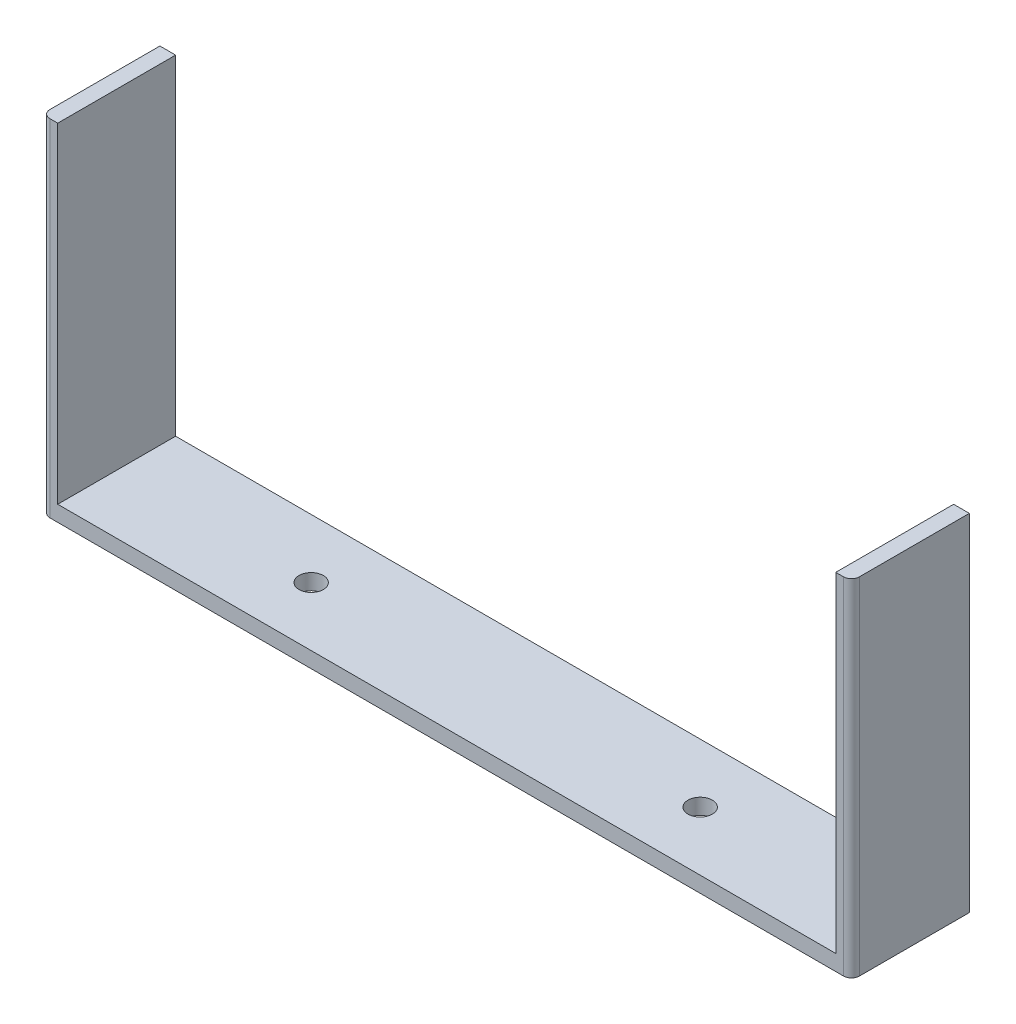
ISO-10303-21;
HEADER;
FILE_DESCRIPTION(('STEP AP214'),'2;1');
FILE_NAME('part.step','',(''),(''),'','','');
FILE_SCHEMA(('AUTOMOTIVE_DESIGN { 1 0 10303 214 1 1 1 1 }'));
ENDSEC;
DATA;
#1=APPLICATION_CONTEXT('core data for automotive mechanical design processes');
#2=APPLICATION_PROTOCOL_DEFINITION('international standard','automotive_design',2000,#1);
#3=PRODUCT_CONTEXT('',#1,'mechanical');
#4=PRODUCT('Part','Part','',(#3));
#5=PRODUCT_RELATED_PRODUCT_CATEGORY('part','',(#4));
#6=PRODUCT_DEFINITION_FORMATION('','',#4);
#7=PRODUCT_DEFINITION_CONTEXT('part definition',#1,'design');
#8=PRODUCT_DEFINITION('design','',#6,#7);
#9=PRODUCT_DEFINITION_SHAPE('','',#8);
#10=(LENGTH_UNIT() NAMED_UNIT(*) SI_UNIT(.MILLI.,.METRE.));
#11=(NAMED_UNIT(*) PLANE_ANGLE_UNIT() SI_UNIT($,.RADIAN.));
#12=(NAMED_UNIT(*) SI_UNIT($,.STERADIAN.) SOLID_ANGLE_UNIT());
#13=UNCERTAINTY_MEASURE_WITH_UNIT(LENGTH_MEASURE(1.E-05),#10,'distance_accuracy_value','');
#14=(GEOMETRIC_REPRESENTATION_CONTEXT(3) GLOBAL_UNCERTAINTY_ASSIGNED_CONTEXT((#13)) GLOBAL_UNIT_ASSIGNED_CONTEXT((#10,
#11,#12)) REPRESENTATION_CONTEXT('',''));
#15=CARTESIAN_POINT('',(0.,0.,0.));
#16=DIRECTION('',(0.,0.,1.));
#17=DIRECTION('',(1.,0.,0.));
#18=AXIS2_PLACEMENT_3D('',#15,#16,#17);
#19=CARTESIAN_POINT('',(-51.5,-2.,7.5));
#20=DIRECTION('',(-1.,0.,0.));
#21=DIRECTION('',(0.,0.,1.));
#22=AXIS2_PLACEMENT_3D('',#19,#20,#21);
#23=PLANE('',#22);
#24=DIRECTION('',(0.,0.,1.));
#25=VECTOR('',#24,1.);
#26=CARTESIAN_POINT('',(-51.5,-2.,7.5));
#27=LINE('',#26,#25);
#28=CARTESIAN_POINT('',(-51.5,-2.,-7.5));
#29=VERTEX_POINT('',#28);
#30=CARTESIAN_POINT('',(-51.5,-2.,6.5));
#31=VERTEX_POINT('',#30);
#32=EDGE_CURVE('E174',#29,#31,#27,.T.);
#33=ORIENTED_EDGE('',*,*,#32,.T.);
#34=DIRECTION('',(0.,1.,0.));
#35=VECTOR('',#34,1.);
#36=CARTESIAN_POINT('',(-51.5,-2.,6.5));
#37=LINE('',#36,#35);
#38=CARTESIAN_POINT('',(-51.5,42.,6.5));
#39=VERTEX_POINT('',#38);
#40=EDGE_CURVE('E126',#31,#39,#37,.T.);
#41=ORIENTED_EDGE('',*,*,#40,.T.);
#42=DIRECTION('',(0.,0.,1.));
#43=VECTOR('',#42,1.);
#44=CARTESIAN_POINT('',(-51.5,42.,-7.5));
#45=LINE('',#44,#43);
#46=CARTESIAN_POINT('',(-51.5,42.,-7.5));
#47=VERTEX_POINT('',#46);
#48=EDGE_CURVE('E131',#47,#39,#45,.T.);
#49=ORIENTED_EDGE('',*,*,#48,.F.);
#50=DIRECTION('',(0.,1.,0.));
#51=VECTOR('',#50,1.);
#52=CARTESIAN_POINT('',(-51.5,-2.,-7.5));
#53=LINE('',#52,#51);
#54=EDGE_CURVE('E113',#29,#47,#53,.T.);
#55=ORIENTED_EDGE('',*,*,#54,.F.);
#56=EDGE_LOOP('',(#33,#41,#49,#55));
#57=FACE_BOUND('',#56,.T.);
#58=ADVANCED_FACE('F39',(#57),#23,.T.);
#59=CARTESIAN_POINT('',(51.5,-2.,-7.50000000000001));
#60=DIRECTION('',(0.,0.,-1.));
#61=DIRECTION('',(-1.,0.,0.));
#62=AXIS2_PLACEMENT_3D('',#59,#60,#61);
#63=PLANE('',#62);
#64=DIRECTION('',(-1.,0.,0.));
#65=VECTOR('',#64,1.);
#66=CARTESIAN_POINT('',(51.5,0.,-7.50000000000001));
#67=LINE('',#66,#65);
#68=CARTESIAN_POINT('',(49.5,0.,-7.50000000000001));
#69=VERTEX_POINT('',#68);
#70=CARTESIAN_POINT('',(-49.5,0.,-7.5));
#71=VERTEX_POINT('',#70);
#72=EDGE_CURVE('E177',#69,#71,#67,.T.);
#73=ORIENTED_EDGE('',*,*,#72,.F.);
#74=DIRECTION('',(0.,-1.,0.));
#75=VECTOR('',#74,1.);
#76=CARTESIAN_POINT('',(49.5,42.,-7.50000000000001));
#77=LINE('',#76,#75);
#78=CARTESIAN_POINT('',(49.5,42.,-7.50000000000001));
#79=VERTEX_POINT('',#78);
#80=EDGE_CURVE('E157',#79,#69,#77,.T.);
#81=ORIENTED_EDGE('',*,*,#80,.F.);
#82=DIRECTION('',(-1.,0.,0.));
#83=VECTOR('',#82,1.);
#84=CARTESIAN_POINT('',(49.5,42.,-7.50000000000001));
#85=LINE('',#84,#83);
#86=CARTESIAN_POINT('',(51.5,42.,-7.50000000000001));
#87=VERTEX_POINT('',#86);
#88=EDGE_CURVE('E171',#87,#79,#85,.T.);
#89=ORIENTED_EDGE('',*,*,#88,.F.);
#90=DIRECTION('',(0.,1.,0.));
#91=VECTOR('',#90,1.);
#92=CARTESIAN_POINT('',(51.5,-2.,-7.50000000000001));
#93=LINE('',#92,#91);
#94=CARTESIAN_POINT('',(51.5,-2.,-7.50000000000001));
#95=VERTEX_POINT('',#94);
#96=EDGE_CURVE('E127',#95,#87,#93,.T.);
#97=ORIENTED_EDGE('',*,*,#96,.F.);
#98=DIRECTION('',(-1.,0.,0.));
#99=VECTOR('',#98,1.);
#100=CARTESIAN_POINT('',(51.5,-2.,-7.50000000000001));
#101=LINE('',#100,#99);
#102=EDGE_CURVE('E122',#95,#29,#101,.T.);
#103=ORIENTED_EDGE('',*,*,#102,.T.);
#104=ORIENTED_EDGE('',*,*,#54,.T.);
#105=DIRECTION('',(-1.,0.,0.));
#106=VECTOR('',#105,1.);
#107=CARTESIAN_POINT('',(-49.5,42.,-7.5));
#108=LINE('',#107,#106);
#109=CARTESIAN_POINT('',(-49.5,42.,-7.5));
#110=VERTEX_POINT('',#109);
#111=EDGE_CURVE('E119',#110,#47,#108,.T.);
#112=ORIENTED_EDGE('',*,*,#111,.F.);
#113=DIRECTION('',(0.,-1.,0.));
#114=VECTOR('',#113,1.);
#115=CARTESIAN_POINT('',(-49.5,42.,-7.5));
#116=LINE('',#115,#114);
#117=EDGE_CURVE('E150',#110,#71,#116,.T.);
#118=ORIENTED_EDGE('',*,*,#117,.T.);
#119=EDGE_LOOP('',(#73,#81,#89,#97,#103,#104,#112,#118));
#120=FACE_BOUND('',#119,.T.);
#121=ADVANCED_FACE('F116',(#120),#63,.T.);
#122=CARTESIAN_POINT('',(51.5,-2.,7.49999999999999));
#123=DIRECTION('',(1.,0.,0.));
#124=DIRECTION('',(0.,0.,-1.));
#125=AXIS2_PLACEMENT_3D('',#122,#123,#124);
#126=PLANE('',#125);
#127=DIRECTION('',(0.,0.,-1.));
#128=VECTOR('',#127,1.);
#129=CARTESIAN_POINT('',(51.5,42.,-7.50000000000001));
#130=LINE('',#129,#128);
#131=CARTESIAN_POINT('',(51.5,42.,6.49999999999999));
#132=VERTEX_POINT('',#131);
#133=EDGE_CURVE('E167',#132,#87,#130,.T.);
#134=ORIENTED_EDGE('',*,*,#133,.F.);
#135=DIRECTION('',(0.,1.,0.));
#136=VECTOR('',#135,1.);
#137=CARTESIAN_POINT('',(51.5,-2.,6.49999999999999));
#138=LINE('',#137,#136);
#139=CARTESIAN_POINT('',(51.5,-2.,6.49999999999999));
#140=VERTEX_POINT('',#139);
#141=EDGE_CURVE('E11',#132,#140,#138,.F.);
#142=ORIENTED_EDGE('',*,*,#141,.T.);
#143=DIRECTION('',(0.,0.,-1.));
#144=VECTOR('',#143,1.);
#145=CARTESIAN_POINT('',(51.5,-2.,7.49999999999999));
#146=LINE('',#145,#144);
#147=EDGE_CURVE('E180',#140,#95,#146,.T.);
#148=ORIENTED_EDGE('',*,*,#147,.T.);
#149=ORIENTED_EDGE('',*,*,#96,.T.);
#150=EDGE_LOOP('',(#134,#142,#148,#149));
#151=FACE_BOUND('',#150,.T.);
#152=ADVANCED_FACE('F236',(#151),#126,.T.);
#153=CARTESIAN_POINT('',(51.5,-2.,7.49999999999999));
#154=DIRECTION('',(0.,0.,1.));
#155=DIRECTION('',(1.,0.,0.));
#156=AXIS2_PLACEMENT_3D('',#153,#154,#155);
#157=PLANE('',#156);
#158=DIRECTION('',(1.,0.,0.));
#159=VECTOR('',#158,1.);
#160=CARTESIAN_POINT('',(-49.5,42.,7.5));
#161=LINE('',#160,#159);
#162=CARTESIAN_POINT('',(-50.5,42.,7.5));
#163=VERTEX_POINT('',#162);
#164=CARTESIAN_POINT('',(-49.5,42.,7.5));
#165=VERTEX_POINT('',#164);
#166=EDGE_CURVE('E134',#163,#165,#161,.T.);
#167=ORIENTED_EDGE('',*,*,#166,.F.);
#168=DIRECTION('',(0.,1.,0.));
#169=VECTOR('',#168,1.);
#170=CARTESIAN_POINT('',(-50.5,-2.,7.5));
#171=LINE('',#170,#169);
#172=CARTESIAN_POINT('',(-50.5,-2.,7.5));
#173=VERTEX_POINT('',#172);
#174=EDGE_CURVE('E193',#163,#173,#171,.F.);
#175=ORIENTED_EDGE('',*,*,#174,.T.);
#176=DIRECTION('',(1.,0.,0.));
#177=VECTOR('',#176,1.);
#178=CARTESIAN_POINT('',(51.5,-2.,7.49999999999999));
#179=LINE('',#178,#177);
#180=CARTESIAN_POINT('',(50.5,-2.,7.49999999999999));
#181=VERTEX_POINT('',#180);
#182=EDGE_CURVE('E176',#173,#181,#179,.T.);
#183=ORIENTED_EDGE('',*,*,#182,.T.);
#184=DIRECTION('',(0.,1.,0.));
#185=VECTOR('',#184,1.);
#186=CARTESIAN_POINT('',(50.5,-2.,7.49999999999999));
#187=LINE('',#186,#185);
#188=CARTESIAN_POINT('',(50.5,42.,7.49999999999999));
#189=VERTEX_POINT('',#188);
#190=EDGE_CURVE('E190',#181,#189,#187,.T.);
#191=ORIENTED_EDGE('',*,*,#190,.T.);
#192=DIRECTION('',(1.,0.,0.));
#193=VECTOR('',#192,1.);
#194=CARTESIAN_POINT('',(49.5,42.,7.49999999999999));
#195=LINE('',#194,#193);
#196=CARTESIAN_POINT('',(49.5,42.,7.49999999999999));
#197=VERTEX_POINT('',#196);
#198=EDGE_CURVE('E164',#197,#189,#195,.T.);
#199=ORIENTED_EDGE('',*,*,#198,.F.);
#200=DIRECTION('',(0.,-1.,0.));
#201=VECTOR('',#200,1.);
#202=CARTESIAN_POINT('',(49.5,42.,7.49999999999999));
#203=LINE('',#202,#201);
#204=CARTESIAN_POINT('',(49.5,0.,7.49999999999999));
#205=VERTEX_POINT('',#204);
#206=EDGE_CURVE('E160',#197,#205,#203,.T.);
#207=ORIENTED_EDGE('',*,*,#206,.T.);
#208=DIRECTION('',(1.,0.,0.));
#209=VECTOR('',#208,1.);
#210=CARTESIAN_POINT('',(51.5,0.,7.49999999999999));
#211=LINE('',#210,#209);
#212=CARTESIAN_POINT('',(-49.5,0.,7.5));
#213=VERTEX_POINT('',#212);
#214=EDGE_CURVE('E156',#213,#205,#211,.T.);
#215=ORIENTED_EDGE('',*,*,#214,.F.);
#216=DIRECTION('',(0.,-1.,0.));
#217=VECTOR('',#216,1.);
#218=CARTESIAN_POINT('',(-49.5,42.,7.5));
#219=LINE('',#218,#217);
#220=EDGE_CURVE('E153',#165,#213,#219,.T.);
#221=ORIENTED_EDGE('',*,*,#220,.F.);
#222=EDGE_LOOP('',(#167,#175,#183,#191,#199,#207,#215,#221));
#223=FACE_BOUND('',#222,.T.);
#224=ADVANCED_FACE('F208',(#223),#157,.T.);
#225=CARTESIAN_POINT('',(0.,-2.,0.));
#226=DIRECTION('',(0.,1.,0.));
#227=DIRECTION('',(0.,0.,1.));
#228=AXIS2_PLACEMENT_3D('',#225,#226,#227);
#229=PLANE('',#228);
#230=CARTESIAN_POINT('',(24.75,-2.,0.));
#231=DIRECTION('',(0.,1.,0.));
#232=DIRECTION('',(0.,0.,1.));
#233=AXIS2_PLACEMENT_3D('',#230,#231,#232);
#234=CIRCLE('',#233,1.54999999999999);
#235=CARTESIAN_POINT('',(24.75,-2.,1.54999999999999));
#236=VERTEX_POINT('',#235);
#237=EDGE_CURVE('E161',#236,#236,#234,.T.);
#238=ORIENTED_EDGE('',*,*,#237,.T.);
#239=EDGE_LOOP('',(#238));
#240=FACE_BOUND('',#239,.T.);
#241=CARTESIAN_POINT('',(-24.75,-2.,0.));
#242=DIRECTION('',(0.,1.,0.));
#243=DIRECTION('',(0.,0.,-1.));
#244=AXIS2_PLACEMENT_3D('',#241,#242,#243);
#245=CIRCLE('',#244,1.55);
#246=CARTESIAN_POINT('',(-24.75,-2.,-1.55000000000008));
#247=VERTEX_POINT('',#246);
#248=EDGE_CURVE('E146',#247,#247,#245,.T.);
#249=ORIENTED_EDGE('',*,*,#248,.T.);
#250=EDGE_LOOP('',(#249));
#251=FACE_BOUND('',#250,.T.);
#252=ORIENTED_EDGE('',*,*,#182,.F.);
#253=CARTESIAN_POINT('',(-50.5,-2.,6.5));
#254=DIRECTION('',(0.,1.,0.));
#255=DIRECTION('',(0.,0.,1.));
#256=AXIS2_PLACEMENT_3D('',#253,#254,#255);
#257=CIRCLE('',#256,1.);
#258=EDGE_CURVE('E197',#173,#31,#257,.F.);
#259=ORIENTED_EDGE('',*,*,#258,.T.);
#260=ORIENTED_EDGE('',*,*,#32,.F.);
#261=ORIENTED_EDGE('',*,*,#102,.F.);
#262=ORIENTED_EDGE('',*,*,#147,.F.);
#263=CARTESIAN_POINT('',(50.5,-2.,6.49999999999999));
#264=DIRECTION('',(0.,1.,0.));
#265=DIRECTION('',(0.,0.,1.));
#266=AXIS2_PLACEMENT_3D('',#263,#264,#265);
#267=CIRCLE('',#266,1.);
#268=EDGE_CURVE('E195',#140,#181,#267,.F.);
#269=ORIENTED_EDGE('',*,*,#268,.T.);
#270=EDGE_LOOP('',(#252,#259,#260,#261,#262,#269));
#271=FACE_BOUND('',#270,.T.);
#272=ADVANCED_FACE('F201',(#240,#251,#271),#229,.F.);
#273=CARTESIAN_POINT('',(0.,0.,0.));
#274=DIRECTION('',(0.,1.,0.));
#275=DIRECTION('',(0.,0.,1.));
#276=AXIS2_PLACEMENT_3D('',#273,#274,#275);
#277=PLANE('',#276);
#278=CARTESIAN_POINT('',(24.75,0.,0.));
#279=DIRECTION('',(0.,1.,0.));
#280=DIRECTION('',(0.,0.,1.));
#281=AXIS2_PLACEMENT_3D('',#278,#279,#280);
#282=CIRCLE('',#281,1.54999999999999);
#283=CARTESIAN_POINT('',(24.75,0.,1.54999999999999));
#284=VERTEX_POINT('',#283);
#285=EDGE_CURVE('E269',#284,#284,#282,.T.);
#286=ORIENTED_EDGE('',*,*,#285,.F.);
#287=EDGE_LOOP('',(#286));
#288=FACE_BOUND('',#287,.T.);
#289=CARTESIAN_POINT('',(-24.75,0.,0.));
#290=DIRECTION('',(0.,1.,0.));
#291=DIRECTION('',(0.,0.,-1.));
#292=AXIS2_PLACEMENT_3D('',#289,#290,#291);
#293=CIRCLE('',#292,1.55);
#294=CARTESIAN_POINT('',(-24.75,0.,-1.55000000000008));
#295=VERTEX_POINT('',#294);
#296=EDGE_CURVE('E270',#295,#295,#293,.T.);
#297=ORIENTED_EDGE('',*,*,#296,.F.);
#298=EDGE_LOOP('',(#297));
#299=FACE_BOUND('',#298,.T.);
#300=DIRECTION('',(0.,0.,-1.));
#301=VECTOR('',#300,1.);
#302=CARTESIAN_POINT('',(-49.5,0.,-7.5));
#303=LINE('',#302,#301);
#304=EDGE_CURVE('E140',#213,#71,#303,.T.);
#305=ORIENTED_EDGE('',*,*,#304,.F.);
#306=ORIENTED_EDGE('',*,*,#214,.T.);
#307=DIRECTION('',(0.,0.,1.));
#308=VECTOR('',#307,1.);
#309=CARTESIAN_POINT('',(49.5,0.,-7.50000000000001));
#310=LINE('',#309,#308);
#311=EDGE_CURVE('E143',#69,#205,#310,.T.);
#312=ORIENTED_EDGE('',*,*,#311,.F.);
#313=ORIENTED_EDGE('',*,*,#72,.T.);
#314=EDGE_LOOP('',(#305,#306,#312,#313));
#315=FACE_BOUND('',#314,.T.);
#316=ADVANCED_FACE('F242',(#288,#299,#315),#277,.T.);
#317=CARTESIAN_POINT('',(49.5,42.,-7.50000000000001));
#318=DIRECTION('',(1.,0.,0.));
#319=DIRECTION('',(0.,0.,-1.));
#320=AXIS2_PLACEMENT_3D('',#317,#318,#319);
#321=PLANE('',#320);
#322=ORIENTED_EDGE('',*,*,#311,.T.);
#323=ORIENTED_EDGE('',*,*,#206,.F.);
#324=DIRECTION('',(0.,0.,1.));
#325=VECTOR('',#324,1.);
#326=CARTESIAN_POINT('',(49.5,42.,-7.50000000000001));
#327=LINE('',#326,#325);
#328=EDGE_CURVE('E169',#79,#197,#327,.T.);
#329=ORIENTED_EDGE('',*,*,#328,.F.);
#330=ORIENTED_EDGE('',*,*,#80,.T.);
#331=EDGE_LOOP('',(#322,#323,#329,#330));
#332=FACE_BOUND('',#331,.T.);
#333=ADVANCED_FACE('F217',(#332),#321,.F.);
#334=CARTESIAN_POINT('',(0.,42.,0.));
#335=DIRECTION('',(0.,1.,0.));
#336=DIRECTION('',(0.,0.,1.));
#337=AXIS2_PLACEMENT_3D('',#334,#335,#336);
#338=PLANE('',#337);
#339=ORIENTED_EDGE('',*,*,#198,.T.);
#340=CARTESIAN_POINT('',(50.5,42.,6.49999999999999));
#341=DIRECTION('',(0.,1.,0.));
#342=DIRECTION('',(0.,0.,1.));
#343=AXIS2_PLACEMENT_3D('',#340,#341,#342);
#344=CIRCLE('',#343,1.);
#345=EDGE_CURVE('E47',#189,#132,#344,.T.);
#346=ORIENTED_EDGE('',*,*,#345,.T.);
#347=ORIENTED_EDGE('',*,*,#133,.T.);
#348=ORIENTED_EDGE('',*,*,#88,.T.);
#349=ORIENTED_EDGE('',*,*,#328,.T.);
#350=EDGE_LOOP('',(#339,#346,#347,#348,#349));
#351=FACE_BOUND('',#350,.T.);
#352=ADVANCED_FACE('F220',(#351),#338,.T.);
#353=CARTESIAN_POINT('',(-49.5,42.,-7.5));
#354=DIRECTION('',(-1.,0.,0.));
#355=DIRECTION('',(0.,0.,1.));
#356=AXIS2_PLACEMENT_3D('',#353,#354,#355);
#357=PLANE('',#356);
#358=ORIENTED_EDGE('',*,*,#304,.T.);
#359=ORIENTED_EDGE('',*,*,#117,.F.);
#360=DIRECTION('',(0.,0.,-1.));
#361=VECTOR('',#360,1.);
#362=CARTESIAN_POINT('',(-49.5,42.,-7.5));
#363=LINE('',#362,#361);
#364=EDGE_CURVE('E138',#165,#110,#363,.T.);
#365=ORIENTED_EDGE('',*,*,#364,.F.);
#366=ORIENTED_EDGE('',*,*,#220,.T.);
#367=EDGE_LOOP('',(#358,#359,#365,#366));
#368=FACE_BOUND('',#367,.T.);
#369=ADVANCED_FACE('F211',(#368),#357,.F.);
#370=CARTESIAN_POINT('',(0.,42.,0.));
#371=DIRECTION('',(0.,1.,0.));
#372=DIRECTION('',(0.,0.,1.));
#373=AXIS2_PLACEMENT_3D('',#370,#371,#372);
#374=PLANE('',#373);
#375=ORIENTED_EDGE('',*,*,#48,.T.);
#376=CARTESIAN_POINT('',(-50.5,42.,6.5));
#377=DIRECTION('',(0.,1.,0.));
#378=DIRECTION('',(0.,0.,1.));
#379=AXIS2_PLACEMENT_3D('',#376,#377,#378);
#380=CIRCLE('',#379,1.);
#381=EDGE_CURVE('E188',#39,#163,#380,.T.);
#382=ORIENTED_EDGE('',*,*,#381,.T.);
#383=ORIENTED_EDGE('',*,*,#166,.T.);
#384=ORIENTED_EDGE('',*,*,#364,.T.);
#385=ORIENTED_EDGE('',*,*,#111,.T.);
#386=EDGE_LOOP('',(#375,#382,#383,#384,#385));
#387=FACE_BOUND('',#386,.T.);
#388=ADVANCED_FACE('F136',(#387),#374,.T.);
#389=CARTESIAN_POINT('',(-24.75,-2.,0.));
#390=DIRECTION('',(0.,1.,0.));
#391=DIRECTION('',(0.,0.,1.));
#392=AXIS2_PLACEMENT_3D('',#389,#390,#391);
#393=CYLINDRICAL_SURFACE('',#392,1.55);
#394=ORIENTED_EDGE('',*,*,#248,.F.);
#395=EDGE_LOOP('',(#394));
#396=FACE_BOUND('',#395,.T.);
#397=ORIENTED_EDGE('',*,*,#296,.T.);
#398=EDGE_LOOP('',(#397));
#399=FACE_BOUND('',#398,.T.);
#400=ADVANCED_FACE('F257',(#396,#399),#393,.F.);
#401=CARTESIAN_POINT('',(24.75,-2.,0.));
#402=DIRECTION('',(0.,1.,0.));
#403=DIRECTION('',(0.,0.,1.));
#404=AXIS2_PLACEMENT_3D('',#401,#402,#403);
#405=CYLINDRICAL_SURFACE('',#404,1.54999999999999);
#406=ORIENTED_EDGE('',*,*,#237,.F.);
#407=EDGE_LOOP('',(#406));
#408=FACE_BOUND('',#407,.T.);
#409=ORIENTED_EDGE('',*,*,#285,.T.);
#410=EDGE_LOOP('',(#409));
#411=FACE_BOUND('',#410,.T.);
#412=ADVANCED_FACE('F228',(#408,#411),#405,.F.);
#413=CARTESIAN_POINT('',(-50.5,-2.,6.5));
#414=DIRECTION('',(0.,1.,0.));
#415=DIRECTION('',(0.,0.,1.));
#416=AXIS2_PLACEMENT_3D('',#413,#414,#415);
#417=CYLINDRICAL_SURFACE('',#416,1.);
#418=ORIENTED_EDGE('',*,*,#258,.F.);
#419=ORIENTED_EDGE('',*,*,#174,.F.);
#420=ORIENTED_EDGE('',*,*,#381,.F.);
#421=ORIENTED_EDGE('',*,*,#40,.F.);
#422=EDGE_LOOP('',(#418,#419,#420,#421));
#423=FACE_BOUND('',#422,.T.);
#424=ADVANCED_FACE('F204',(#423),#417,.T.);
#425=CARTESIAN_POINT('',(50.5,-2.,6.49999999999999));
#426=DIRECTION('',(0.,1.,0.));
#427=DIRECTION('',(0.,0.,1.));
#428=AXIS2_PLACEMENT_3D('',#425,#426,#427);
#429=CYLINDRICAL_SURFACE('',#428,1.);
#430=ORIENTED_EDGE('',*,*,#268,.F.);
#431=ORIENTED_EDGE('',*,*,#141,.F.);
#432=ORIENTED_EDGE('',*,*,#345,.F.);
#433=ORIENTED_EDGE('',*,*,#190,.F.);
#434=EDGE_LOOP('',(#430,#431,#432,#433));
#435=FACE_BOUND('',#434,.T.);
#436=ADVANCED_FACE('F41',(#435),#429,.T.);
#437=CLOSED_SHELL('',(#58,#121,#152,#224,#272,#316,#333,#352,#369,#388,#400,#412,#424,#436));
#438=MANIFOLD_SOLID_BREP('B2',#437);
#439=ADVANCED_BREP_SHAPE_REPRESENTATION('',(#18,#438),#14);
#440=SHAPE_DEFINITION_REPRESENTATION(#9,#439);
ENDSEC;
END-ISO-10303-21;
